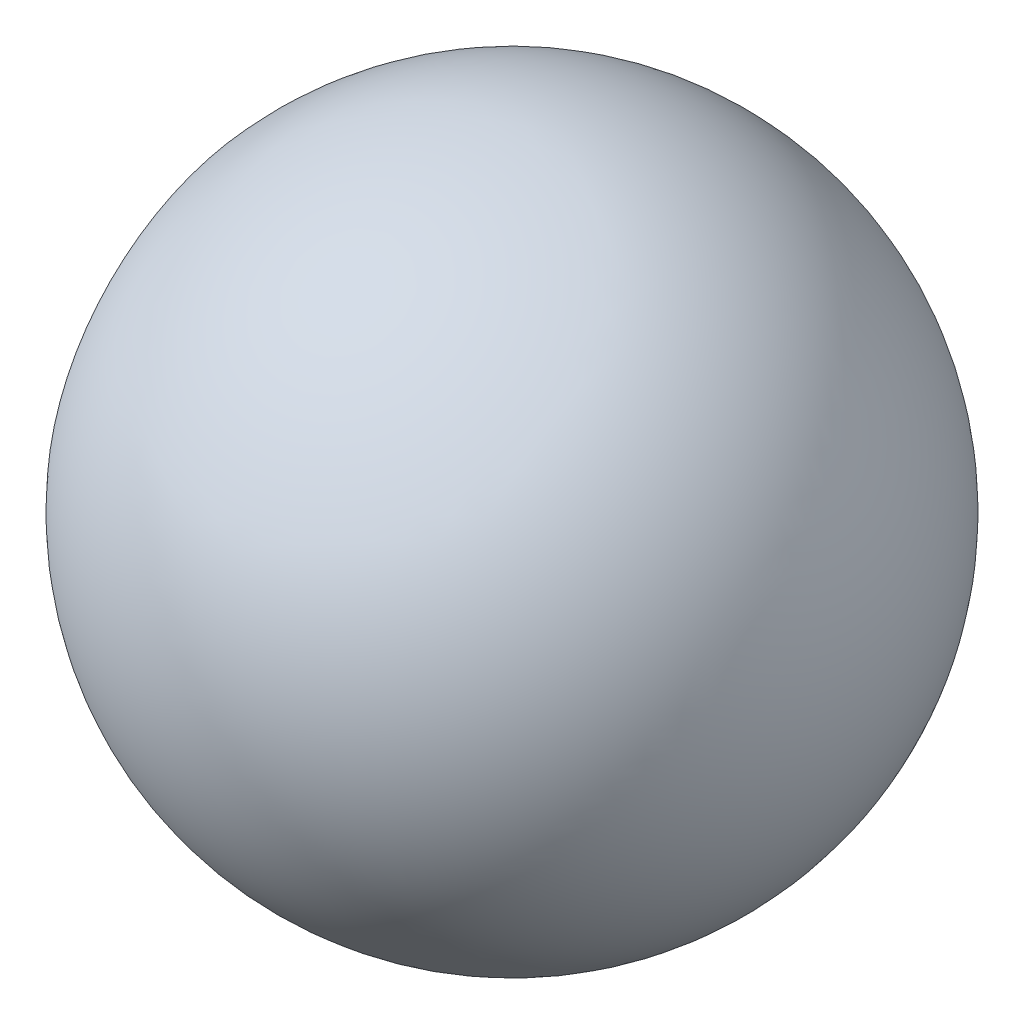
ISO-10303-21;
HEADER;
FILE_DESCRIPTION(('STEP AP214'),'2;1');
FILE_NAME('part.step','',(''),(''),'','','');
FILE_SCHEMA(('AUTOMOTIVE_DESIGN { 1 0 10303 214 1 1 1 1 }'));
ENDSEC;
DATA;
#1=APPLICATION_CONTEXT('core data for automotive mechanical design processes');
#2=APPLICATION_PROTOCOL_DEFINITION('international standard','automotive_design',2000,#1);
#3=PRODUCT_CONTEXT('',#1,'mechanical');
#4=PRODUCT('Part','Part','',(#3));
#5=PRODUCT_RELATED_PRODUCT_CATEGORY('part','',(#4));
#6=PRODUCT_DEFINITION_FORMATION('','',#4);
#7=PRODUCT_DEFINITION_CONTEXT('part definition',#1,'design');
#8=PRODUCT_DEFINITION('design','',#6,#7);
#9=PRODUCT_DEFINITION_SHAPE('','',#8);
#10=(LENGTH_UNIT() NAMED_UNIT(*) SI_UNIT(.MILLI.,.METRE.));
#11=(NAMED_UNIT(*) PLANE_ANGLE_UNIT() SI_UNIT($,.RADIAN.));
#12=(NAMED_UNIT(*) SI_UNIT($,.STERADIAN.) SOLID_ANGLE_UNIT());
#13=UNCERTAINTY_MEASURE_WITH_UNIT(LENGTH_MEASURE(1.E-05),#10,'distance_accuracy_value','');
#14=(GEOMETRIC_REPRESENTATION_CONTEXT(3) GLOBAL_UNCERTAINTY_ASSIGNED_CONTEXT((#13)) GLOBAL_UNIT_ASSIGNED_CONTEXT((#10,
#11,#12)) REPRESENTATION_CONTEXT('',''));
#15=CARTESIAN_POINT('',(0.,0.,0.));
#16=DIRECTION('',(0.,0.,1.));
#17=DIRECTION('',(1.,0.,0.));
#18=AXIS2_PLACEMENT_3D('',#15,#16,#17);
#19=CARTESIAN_POINT('',(-6.,5.29150262212918,0.));
#20=DIRECTION('',(-1.,0.,0.));
#21=DIRECTION('',(0.,-1.,0.));
#22=AXIS2_PLACEMENT_3D('',#19,#20,#21);
#23=PLANE('',#22);
#24=CARTESIAN_POINT('',(-6.,0.,0.));
#25=DIRECTION('',(-1.,0.,0.));
#26=DIRECTION('',(0.,0.,1.));
#27=AXIS2_PLACEMENT_3D('',#24,#25,#26);
#28=CIRCLE('',#27,2.5);
#29=CARTESIAN_POINT('',(-6.,0.,2.5));
#30=VERTEX_POINT('',#29);
#31=EDGE_CURVE('E63',#30,#30,#28,.T.);
#32=ORIENTED_EDGE('',*,*,#31,.F.);
#33=EDGE_LOOP('',(#32));
#34=FACE_BOUND('',#33,.T.);
#35=CARTESIAN_POINT('',(-6.,0.,0.));
#36=DIRECTION('',(1.,0.,0.));
#37=DIRECTION('',(0.,1.,0.));
#38=AXIS2_PLACEMENT_3D('',#35,#36,#37);
#39=CIRCLE('',#38,5.29150262212918);
#40=CARTESIAN_POINT('',(-6.,5.29150262212918,0.));
#41=VERTEX_POINT('',#40);
#42=EDGE_CURVE('E11',#41,#41,#39,.T.);
#43=ORIENTED_EDGE('',*,*,#42,.F.);
#44=EDGE_LOOP('',(#43));
#45=FACE_BOUND('',#44,.T.);
#46=ADVANCED_FACE('F43',(#34,#45),#23,.T.);
#47=CARTESIAN_POINT('',(0.,0.,0.));
#48=DIRECTION('',(1.,0.,0.));
#49=DIRECTION('',(0.,-1.,0.));
#50=AXIS2_PLACEMENT_3D('',#47,#48,#49);
#51=SPHERICAL_SURFACE('',#50,8.);
#52=ORIENTED_EDGE('',*,*,#42,.T.);
#53=EDGE_LOOP('',(#52));
#54=FACE_BOUND('',#53,.T.);
#55=ADVANCED_FACE('F57',(#54),#51,.T.);
#56=CARTESIAN_POINT('',(4.,0.,0.));
#57=DIRECTION('',(-1.,0.,0.));
#58=DIRECTION('',(0.,0.,1.));
#59=AXIS2_PLACEMENT_3D('',#56,#57,#58);
#60=CONICAL_SURFACE('',#59,2.5,1.02974425867665);
#61=CARTESIAN_POINT('',(5.5021515475689,0.,0.));
#62=VERTEX_POINT('',#61);
#63=VERTEX_LOOP('',#62);
#64=FACE_BOUND('',#63,.T.);
#65=CARTESIAN_POINT('',(4.,0.,0.));
#66=DIRECTION('',(-1.,0.,0.));
#67=DIRECTION('',(0.,0.,1.));
#68=AXIS2_PLACEMENT_3D('',#65,#66,#67);
#69=CIRCLE('',#68,2.5);
#70=CARTESIAN_POINT('',(4.,0.,2.5));
#71=VERTEX_POINT('',#70);
#72=EDGE_CURVE('E50',#71,#71,#69,.T.);
#73=ORIENTED_EDGE('',*,*,#72,.T.);
#74=EDGE_LOOP('',(#73));
#75=FACE_BOUND('',#74,.T.);
#76=ADVANCED_FACE('F53',(#64,#75),#60,.F.);
#77=CARTESIAN_POINT('',(-6.,0.,0.));
#78=DIRECTION('',(-1.,0.,0.));
#79=DIRECTION('',(0.,0.,1.));
#80=AXIS2_PLACEMENT_3D('',#77,#78,#79);
#81=CYLINDRICAL_SURFACE('',#80,2.5);
#82=ORIENTED_EDGE('',*,*,#72,.F.);
#83=EDGE_LOOP('',(#82));
#84=FACE_BOUND('',#83,.T.);
#85=ORIENTED_EDGE('',*,*,#31,.T.);
#86=EDGE_LOOP('',(#85));
#87=FACE_BOUND('',#86,.T.);
#88=ADVANCED_FACE('F56',(#84,#87),#81,.F.);
#89=CLOSED_SHELL('',(#46,#55,#76,#88));
#90=MANIFOLD_SOLID_BREP('B2',#89);
#91=ADVANCED_BREP_SHAPE_REPRESENTATION('',(#18,#90),#14);
#92=SHAPE_DEFINITION_REPRESENTATION(#9,#91);
ENDSEC;
END-ISO-10303-21;
